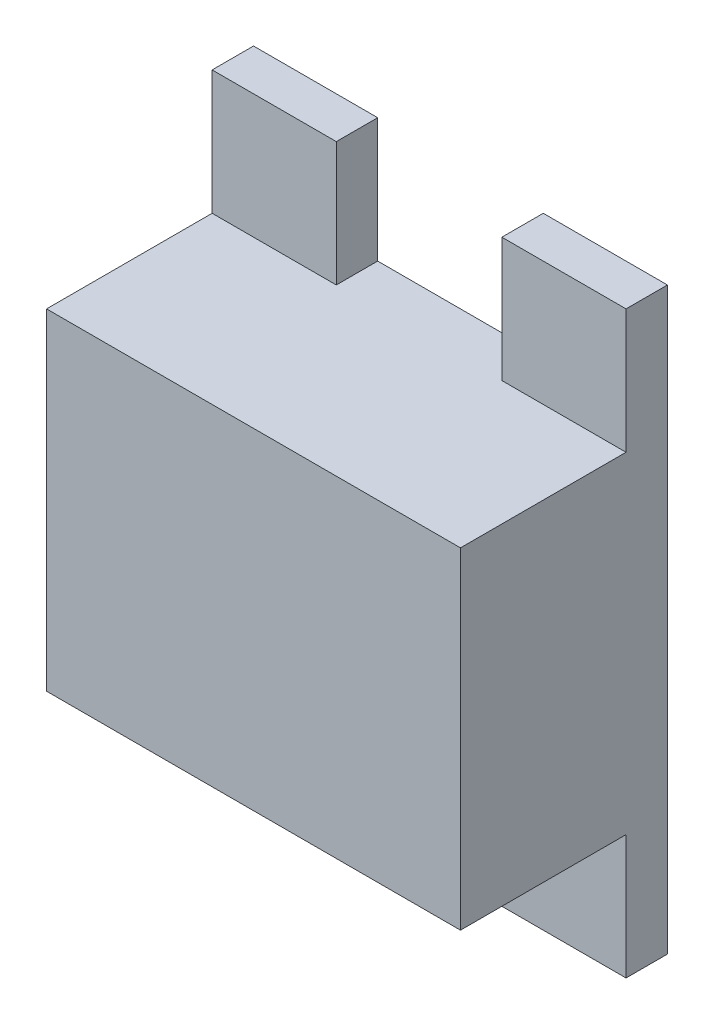
ISO-10303-21;
HEADER;
FILE_DESCRIPTION(('STEP AP214'),'2;1');
FILE_NAME('part.step','',(''),(''),'','','');
FILE_SCHEMA(('AUTOMOTIVE_DESIGN { 1 0 10303 214 1 1 1 1 }'));
ENDSEC;
DATA;
#1=APPLICATION_CONTEXT('core data for automotive mechanical design processes');
#2=APPLICATION_PROTOCOL_DEFINITION('international standard','automotive_design',2000,#1);
#3=PRODUCT_CONTEXT('',#1,'mechanical');
#4=PRODUCT('Part','Part','',(#3));
#5=PRODUCT_RELATED_PRODUCT_CATEGORY('part','',(#4));
#6=PRODUCT_DEFINITION_FORMATION('','',#4);
#7=PRODUCT_DEFINITION_CONTEXT('part definition',#1,'design');
#8=PRODUCT_DEFINITION('design','',#6,#7);
#9=PRODUCT_DEFINITION_SHAPE('','',#8);
#10=(LENGTH_UNIT() NAMED_UNIT(*) SI_UNIT(.MILLI.,.METRE.));
#11=(NAMED_UNIT(*) PLANE_ANGLE_UNIT() SI_UNIT($,.RADIAN.));
#12=(NAMED_UNIT(*) SI_UNIT($,.STERADIAN.) SOLID_ANGLE_UNIT());
#13=UNCERTAINTY_MEASURE_WITH_UNIT(LENGTH_MEASURE(1.E-05),#10,'distance_accuracy_value','');
#14=(GEOMETRIC_REPRESENTATION_CONTEXT(3) GLOBAL_UNCERTAINTY_ASSIGNED_CONTEXT((#13)) GLOBAL_UNIT_ASSIGNED_CONTEXT((#10,
#11,#12)) REPRESENTATION_CONTEXT('',''));
#15=CARTESIAN_POINT('',(0.,0.,0.));
#16=DIRECTION('',(0.,0.,1.));
#17=DIRECTION('',(1.,0.,0.));
#18=AXIS2_PLACEMENT_3D('',#15,#16,#17);
#19=CARTESIAN_POINT('',(0.,0.4,0.186842105263));
#20=DIRECTION('',(-1.,0.,0.));
#21=DIRECTION('',(0.,0.,1.));
#22=AXIS2_PLACEMENT_3D('',#19,#20,#21);
#23=PLANE('',#22);
#24=DIRECTION('',(0.,0.,1.));
#25=VECTOR('',#24,1.);
#26=CARTESIAN_POINT('',(0.,0.,0.));
#27=LINE('',#26,#25);
#28=CARTESIAN_POINT('',(0.,0.,0.1));
#29=VERTEX_POINT('',#28);
#30=CARTESIAN_POINT('',(0.,0.,0.5));
#31=VERTEX_POINT('',#30);
#32=EDGE_CURVE('E259',#29,#31,#27,.T.);
#33=ORIENTED_EDGE('',*,*,#32,.T.);
#34=DIRECTION('',(0.,1.,0.));
#35=VECTOR('',#34,1.);
#36=CARTESIAN_POINT('',(0.,0.,0.5));
#37=LINE('',#36,#35);
#38=CARTESIAN_POINT('',(0.,0.8,0.5));
#39=VERTEX_POINT('',#38);
#40=EDGE_CURVE('E218',#31,#39,#37,.T.);
#41=ORIENTED_EDGE('',*,*,#40,.T.);
#42=DIRECTION('',(0.,0.,1.));
#43=VECTOR('',#42,1.);
#44=CARTESIAN_POINT('',(0.,0.8,0.));
#45=LINE('',#44,#43);
#46=CARTESIAN_POINT('',(0.,0.8,0.1));
#47=VERTEX_POINT('',#46);
#48=EDGE_CURVE('E210',#47,#39,#45,.T.);
#49=ORIENTED_EDGE('',*,*,#48,.F.);
#50=DIRECTION('',(0.,1.,0.));
#51=VECTOR('',#50,1.);
#52=CARTESIAN_POINT('',(0.,0.6,0.1));
#53=LINE('',#52,#51);
#54=CARTESIAN_POINT('',(0.,1.1,0.1));
#55=VERTEX_POINT('',#54);
#56=EDGE_CURVE('E273',#47,#55,#53,.T.);
#57=ORIENTED_EDGE('',*,*,#56,.T.);
#58=DIRECTION('',(0.,0.,1.));
#59=VECTOR('',#58,1.);
#60=CARTESIAN_POINT('',(0.,1.1,0.));
#61=LINE('',#60,#59);
#62=CARTESIAN_POINT('',(0.,1.1,0.));
#63=VERTEX_POINT('',#62);
#64=EDGE_CURVE('E323',#63,#55,#61,.T.);
#65=ORIENTED_EDGE('',*,*,#64,.F.);
#66=DIRECTION('',(0.,1.,0.));
#67=VECTOR('',#66,1.);
#68=CARTESIAN_POINT('',(0.,-0.3,0.));
#69=LINE('',#68,#67);
#70=CARTESIAN_POINT('',(0.,-0.3,0.));
#71=VERTEX_POINT('',#70);
#72=EDGE_CURVE('E25',#71,#63,#69,.T.);
#73=ORIENTED_EDGE('',*,*,#72,.F.);
#74=DIRECTION('',(0.,0.,1.));
#75=VECTOR('',#74,1.);
#76=CARTESIAN_POINT('',(0.,-0.3,0.));
#77=LINE('',#76,#75);
#78=CARTESIAN_POINT('',(0.,-0.3,0.1));
#79=VERTEX_POINT('',#78);
#80=EDGE_CURVE('E335',#71,#79,#77,.T.);
#81=ORIENTED_EDGE('',*,*,#80,.T.);
#82=DIRECTION('',(0.,1.,0.));
#83=VECTOR('',#82,1.);
#84=CARTESIAN_POINT('',(0.,-0.3,0.1));
#85=LINE('',#84,#83);
#86=EDGE_CURVE('E238',#79,#29,#85,.T.);
#87=ORIENTED_EDGE('',*,*,#86,.T.);
#88=EDGE_LOOP('',(#33,#41,#49,#57,#65,#73,#81,#87));
#89=FACE_BOUND('',#88,.T.);
#90=ADVANCED_FACE('F17',(#89),#23,.T.);
#91=CARTESIAN_POINT('',(1.,0.4,0.186842105263));
#92=DIRECTION('',(1.,0.,0.));
#93=DIRECTION('',(0.,1.,0.));
#94=AXIS2_PLACEMENT_3D('',#91,#92,#93);
#95=PLANE('',#94);
#96=DIRECTION('',(0.,1.,0.));
#97=VECTOR('',#96,1.);
#98=CARTESIAN_POINT('',(1.,0.6,0.));
#99=LINE('',#98,#97);
#100=CARTESIAN_POINT('',(1.,-0.3,0.));
#101=VERTEX_POINT('',#100);
#102=CARTESIAN_POINT('',(1.,1.1,0.));
#103=VERTEX_POINT('',#102);
#104=EDGE_CURVE('E11',#101,#103,#99,.T.);
#105=ORIENTED_EDGE('',*,*,#104,.T.);
#106=DIRECTION('',(0.,0.,1.));
#107=VECTOR('',#106,1.);
#108=CARTESIAN_POINT('',(1.,1.1,0.));
#109=LINE('',#108,#107);
#110=CARTESIAN_POINT('',(1.,1.1,0.1));
#111=VERTEX_POINT('',#110);
#112=EDGE_CURVE('E222',#103,#111,#109,.T.);
#113=ORIENTED_EDGE('',*,*,#112,.T.);
#114=DIRECTION('',(0.,1.,0.));
#115=VECTOR('',#114,1.);
#116=CARTESIAN_POINT('',(1.,0.6,0.1));
#117=LINE('',#116,#115);
#118=CARTESIAN_POINT('',(1.,0.8,0.1));
#119=VERTEX_POINT('',#118);
#120=EDGE_CURVE('E178',#119,#111,#117,.T.);
#121=ORIENTED_EDGE('',*,*,#120,.F.);
#122=DIRECTION('',(0.,0.,1.));
#123=VECTOR('',#122,1.);
#124=CARTESIAN_POINT('',(1.,0.8,0.));
#125=LINE('',#124,#123);
#126=CARTESIAN_POINT('',(1.,0.8,0.5));
#127=VERTEX_POINT('',#126);
#128=EDGE_CURVE('E173',#119,#127,#125,.T.);
#129=ORIENTED_EDGE('',*,*,#128,.T.);
#130=DIRECTION('',(0.,1.,0.));
#131=VECTOR('',#130,1.);
#132=CARTESIAN_POINT('',(1.,0.,0.5));
#133=LINE('',#132,#131);
#134=CARTESIAN_POINT('',(1.,0.,0.5));
#135=VERTEX_POINT('',#134);
#136=EDGE_CURVE('E244',#135,#127,#133,.T.);
#137=ORIENTED_EDGE('',*,*,#136,.F.);
#138=DIRECTION('',(0.,0.,1.));
#139=VECTOR('',#138,1.);
#140=CARTESIAN_POINT('',(1.,0.,0.));
#141=LINE('',#140,#139);
#142=CARTESIAN_POINT('',(1.,0.,0.1));
#143=VERTEX_POINT('',#142);
#144=EDGE_CURVE('E258',#143,#135,#141,.T.);
#145=ORIENTED_EDGE('',*,*,#144,.F.);
#146=DIRECTION('',(0.,1.,0.));
#147=VECTOR('',#146,1.);
#148=CARTESIAN_POINT('',(1.,-0.3,0.1));
#149=LINE('',#148,#147);
#150=CARTESIAN_POINT('',(1.,-0.3,0.1));
#151=VERTEX_POINT('',#150);
#152=EDGE_CURVE('E307',#151,#143,#149,.T.);
#153=ORIENTED_EDGE('',*,*,#152,.F.);
#154=DIRECTION('',(0.,0.,1.));
#155=VECTOR('',#154,1.);
#156=CARTESIAN_POINT('',(1.,-0.3,0.));
#157=LINE('',#156,#155);
#158=EDGE_CURVE('E326',#101,#151,#157,.T.);
#159=ORIENTED_EDGE('',*,*,#158,.F.);
#160=EDGE_LOOP('',(#105,#113,#121,#129,#137,#145,#153,#159));
#161=FACE_BOUND('',#160,.T.);
#162=ADVANCED_FACE('F361',(#161),#95,.T.);
#163=CARTESIAN_POINT('',(0.5,0.4,0.));
#164=DIRECTION('',(0.,0.,-1.));
#165=DIRECTION('',(0.,-1.,0.));
#166=AXIS2_PLACEMENT_3D('',#163,#164,#165);
#167=PLANE('',#166);
#168=DIRECTION('',(1.,0.,0.));
#169=VECTOR('',#168,1.);
#170=CARTESIAN_POINT('',(0.7,-0.3,0.));
#171=LINE('',#170,#169);
#172=CARTESIAN_POINT('',(0.7,-0.3,0.));
#173=VERTEX_POINT('',#172);
#174=EDGE_CURVE('E328',#173,#101,#171,.T.);
#175=ORIENTED_EDGE('',*,*,#174,.F.);
#176=DIRECTION('',(0.,1.,0.));
#177=VECTOR('',#176,1.);
#178=CARTESIAN_POINT('',(0.7,-0.3,0.));
#179=LINE('',#178,#177);
#180=CARTESIAN_POINT('',(0.7,0.,0.));
#181=VERTEX_POINT('',#180);
#182=EDGE_CURVE('E293',#173,#181,#179,.T.);
#183=ORIENTED_EDGE('',*,*,#182,.T.);
#184=DIRECTION('',(1.,0.,0.));
#185=VECTOR('',#184,1.);
#186=CARTESIAN_POINT('',(0.,0.,0.));
#187=LINE('',#186,#185);
#188=CARTESIAN_POINT('',(0.3,0.,0.));
#189=VERTEX_POINT('',#188);
#190=EDGE_CURVE('E269',#189,#181,#187,.T.);
#191=ORIENTED_EDGE('',*,*,#190,.F.);
#192=DIRECTION('',(0.,1.,0.));
#193=VECTOR('',#192,1.);
#194=CARTESIAN_POINT('',(0.3,-0.3,0.));
#195=LINE('',#194,#193);
#196=CARTESIAN_POINT('',(0.3,-0.3,0.));
#197=VERTEX_POINT('',#196);
#198=EDGE_CURVE('E320',#197,#189,#195,.T.);
#199=ORIENTED_EDGE('',*,*,#198,.F.);
#200=DIRECTION('',(1.,0.,0.));
#201=VECTOR('',#200,1.);
#202=CARTESIAN_POINT('',(0.,-0.3,0.));
#203=LINE('',#202,#201);
#204=EDGE_CURVE('E333',#71,#197,#203,.T.);
#205=ORIENTED_EDGE('',*,*,#204,.F.);
#206=ORIENTED_EDGE('',*,*,#72,.T.);
#207=DIRECTION('',(1.,0.,0.));
#208=VECTOR('',#207,1.);
#209=CARTESIAN_POINT('',(0.,1.1,0.));
#210=LINE('',#209,#208);
#211=CARTESIAN_POINT('',(0.3,1.1,0.));
#212=VERTEX_POINT('',#211);
#213=EDGE_CURVE('E319',#63,#212,#210,.T.);
#214=ORIENTED_EDGE('',*,*,#213,.T.);
#215=DIRECTION('',(0.,1.,0.));
#216=VECTOR('',#215,1.);
#217=CARTESIAN_POINT('',(0.3,0.6,0.));
#218=LINE('',#217,#216);
#219=CARTESIAN_POINT('',(0.3,0.8,0.));
#220=VERTEX_POINT('',#219);
#221=EDGE_CURVE('E286',#220,#212,#218,.T.);
#222=ORIENTED_EDGE('',*,*,#221,.F.);
#223=DIRECTION('',(1.,0.,0.));
#224=VECTOR('',#223,1.);
#225=CARTESIAN_POINT('',(0.,0.8,0.));
#226=LINE('',#225,#224);
#227=CARTESIAN_POINT('',(0.7,0.8,0.));
#228=VERTEX_POINT('',#227);
#229=EDGE_CURVE('E223',#220,#228,#226,.T.);
#230=ORIENTED_EDGE('',*,*,#229,.T.);
#231=DIRECTION('',(0.,1.,0.));
#232=VECTOR('',#231,1.);
#233=CARTESIAN_POINT('',(0.7,0.6,0.));
#234=LINE('',#233,#232);
#235=CARTESIAN_POINT('',(0.7,1.1,0.));
#236=VERTEX_POINT('',#235);
#237=EDGE_CURVE('E186',#228,#236,#234,.T.);
#238=ORIENTED_EDGE('',*,*,#237,.T.);
#239=DIRECTION('',(1.,0.,0.));
#240=VECTOR('',#239,1.);
#241=CARTESIAN_POINT('',(0.7,1.1,0.));
#242=LINE('',#241,#240);
#243=EDGE_CURVE('E187',#236,#103,#242,.T.);
#244=ORIENTED_EDGE('',*,*,#243,.T.);
#245=ORIENTED_EDGE('',*,*,#104,.F.);
#246=EDGE_LOOP('',(#175,#183,#191,#199,#205,#206,#214,#222,#230,#238,#244,#245));
#247=FACE_BOUND('',#246,.T.);
#248=ADVANCED_FACE('F338',(#247),#167,.T.);
#249=CARTESIAN_POINT('',(0.,-0.3,0.));
#250=DIRECTION('',(0.,1.,0.));
#251=DIRECTION('',(1.,0.,0.));
#252=AXIS2_PLACEMENT_3D('',#249,#250,#251);
#253=PLANE('',#252);
#254=DIRECTION('',(0.,0.,1.));
#255=VECTOR('',#254,1.);
#256=CARTESIAN_POINT('',(0.3,-0.3,0.));
#257=LINE('',#256,#255);
#258=CARTESIAN_POINT('',(0.3,-0.3,0.1));
#259=VERTEX_POINT('',#258);
#260=EDGE_CURVE('E314',#197,#259,#257,.T.);
#261=ORIENTED_EDGE('',*,*,#260,.T.);
#262=DIRECTION('',(1.,0.,0.));
#263=VECTOR('',#262,1.);
#264=CARTESIAN_POINT('',(0.,-0.3,0.1));
#265=LINE('',#264,#263);
#266=EDGE_CURVE('E233',#79,#259,#265,.T.);
#267=ORIENTED_EDGE('',*,*,#266,.F.);
#268=ORIENTED_EDGE('',*,*,#80,.F.);
#269=ORIENTED_EDGE('',*,*,#204,.T.);
#270=EDGE_LOOP('',(#261,#267,#268,#269));
#271=FACE_BOUND('',#270,.T.);
#272=ADVANCED_FACE('F393',(#271),#253,.F.);
#273=CARTESIAN_POINT('',(0.7,-0.3,0.));
#274=DIRECTION('',(0.,1.,0.));
#275=DIRECTION('',(1.,0.,0.));
#276=AXIS2_PLACEMENT_3D('',#273,#274,#275);
#277=PLANE('',#276);
#278=ORIENTED_EDGE('',*,*,#158,.T.);
#279=DIRECTION('',(1.,0.,0.));
#280=VECTOR('',#279,1.);
#281=CARTESIAN_POINT('',(0.7,-0.3,0.1));
#282=LINE('',#281,#280);
#283=CARTESIAN_POINT('',(0.7,-0.3,0.1));
#284=VERTEX_POINT('',#283);
#285=EDGE_CURVE('E303',#284,#151,#282,.T.);
#286=ORIENTED_EDGE('',*,*,#285,.F.);
#287=DIRECTION('',(0.,0.,1.));
#288=VECTOR('',#287,1.);
#289=CARTESIAN_POINT('',(0.7,-0.3,0.));
#290=LINE('',#289,#288);
#291=EDGE_CURVE('E296',#173,#284,#290,.T.);
#292=ORIENTED_EDGE('',*,*,#291,.F.);
#293=ORIENTED_EDGE('',*,*,#174,.T.);
#294=EDGE_LOOP('',(#278,#286,#292,#293));
#295=FACE_BOUND('',#294,.T.);
#296=ADVANCED_FACE('F400',(#295),#277,.F.);
#297=CARTESIAN_POINT('',(0.,1.1,0.));
#298=DIRECTION('',(0.,1.,0.));
#299=DIRECTION('',(1.,0.,0.));
#300=AXIS2_PLACEMENT_3D('',#297,#298,#299);
#301=PLANE('',#300);
#302=ORIENTED_EDGE('',*,*,#213,.F.);
#303=ORIENTED_EDGE('',*,*,#64,.T.);
#304=DIRECTION('',(1.,0.,0.));
#305=VECTOR('',#304,1.);
#306=CARTESIAN_POINT('',(0.,1.1,0.1));
#307=LINE('',#306,#305);
#308=CARTESIAN_POINT('',(0.3,1.1,0.1));
#309=VERTEX_POINT('',#308);
#310=EDGE_CURVE('E282',#55,#309,#307,.T.);
#311=ORIENTED_EDGE('',*,*,#310,.T.);
#312=DIRECTION('',(0.,0.,1.));
#313=VECTOR('',#312,1.);
#314=CARTESIAN_POINT('',(0.3,1.1,0.));
#315=LINE('',#314,#313);
#316=EDGE_CURVE('E289',#212,#309,#315,.T.);
#317=ORIENTED_EDGE('',*,*,#316,.F.);
#318=EDGE_LOOP('',(#302,#303,#311,#317));
#319=FACE_BOUND('',#318,.T.);
#320=ADVANCED_FACE('F346',(#319),#301,.T.);
#321=CARTESIAN_POINT('',(0.3,-0.3,0.));
#322=DIRECTION('',(1.,0.,0.));
#323=DIRECTION('',(0.,1.,0.));
#324=AXIS2_PLACEMENT_3D('',#321,#322,#323);
#325=PLANE('',#324);
#326=DIRECTION('',(0.,1.,0.));
#327=VECTOR('',#326,1.);
#328=CARTESIAN_POINT('',(0.3,-0.3,0.1));
#329=LINE('',#328,#327);
#330=CARTESIAN_POINT('',(0.3,0.,0.1));
#331=VERTEX_POINT('',#330);
#332=EDGE_CURVE('E236',#259,#331,#329,.T.);
#333=ORIENTED_EDGE('',*,*,#332,.F.);
#334=ORIENTED_EDGE('',*,*,#260,.F.);
#335=ORIENTED_EDGE('',*,*,#198,.T.);
#336=DIRECTION('',(0.,0.,-1.));
#337=VECTOR('',#336,1.);
#338=CARTESIAN_POINT('',(0.3,0.,0.));
#339=LINE('',#338,#337);
#340=EDGE_CURVE('E266',#331,#189,#339,.T.);
#341=ORIENTED_EDGE('',*,*,#340,.F.);
#342=EDGE_LOOP('',(#333,#334,#335,#341));
#343=FACE_BOUND('',#342,.T.);
#344=ADVANCED_FACE('F404',(#343),#325,.T.);
#345=CARTESIAN_POINT('',(0.,-0.3,0.1));
#346=DIRECTION('',(0.,0.,1.));
#347=DIRECTION('',(1.,0.,0.));
#348=AXIS2_PLACEMENT_3D('',#345,#346,#347);
#349=PLANE('',#348);
#350=ORIENTED_EDGE('',*,*,#86,.F.);
#351=ORIENTED_EDGE('',*,*,#266,.T.);
#352=ORIENTED_EDGE('',*,*,#332,.T.);
#353=DIRECTION('',(1.,0.,0.));
#354=VECTOR('',#353,1.);
#355=CARTESIAN_POINT('',(0.,0.,0.1));
#356=LINE('',#355,#354);
#357=EDGE_CURVE('E265',#29,#331,#356,.T.);
#358=ORIENTED_EDGE('',*,*,#357,.F.);
#359=EDGE_LOOP('',(#350,#351,#352,#358));
#360=FACE_BOUND('',#359,.T.);
#361=ADVANCED_FACE('F405',(#360),#349,.T.);
#362=CARTESIAN_POINT('',(0.7,-0.3,0.1));
#363=DIRECTION('',(0.,0.,1.));
#364=DIRECTION('',(1.,0.,0.));
#365=AXIS2_PLACEMENT_3D('',#362,#363,#364);
#366=PLANE('',#365);
#367=DIRECTION('',(0.,1.,0.));
#368=VECTOR('',#367,1.);
#369=CARTESIAN_POINT('',(0.7,-0.3,0.1));
#370=LINE('',#369,#368);
#371=CARTESIAN_POINT('',(0.7,0.,0.1));
#372=VERTEX_POINT('',#371);
#373=EDGE_CURVE('E299',#284,#372,#370,.T.);
#374=ORIENTED_EDGE('',*,*,#373,.F.);
#375=ORIENTED_EDGE('',*,*,#285,.T.);
#376=ORIENTED_EDGE('',*,*,#152,.T.);
#377=DIRECTION('',(1.,0.,0.));
#378=VECTOR('',#377,1.);
#379=CARTESIAN_POINT('',(0.35,0.,0.1));
#380=LINE('',#379,#378);
#381=EDGE_CURVE('E252',#372,#143,#380,.T.);
#382=ORIENTED_EDGE('',*,*,#381,.F.);
#383=EDGE_LOOP('',(#374,#375,#376,#382));
#384=FACE_BOUND('',#383,.T.);
#385=ADVANCED_FACE('F402',(#384),#366,.T.);
#386=CARTESIAN_POINT('',(0.7,-0.3,0.));
#387=DIRECTION('',(1.,0.,0.));
#388=DIRECTION('',(0.,1.,0.));
#389=AXIS2_PLACEMENT_3D('',#386,#387,#388);
#390=PLANE('',#389);
#391=DIRECTION('',(0.,0.,-1.));
#392=VECTOR('',#391,1.);
#393=CARTESIAN_POINT('',(0.7,0.,0.));
#394=LINE('',#393,#392);
#395=EDGE_CURVE('E248',#372,#181,#394,.T.);
#396=ORIENTED_EDGE('',*,*,#395,.T.);
#397=ORIENTED_EDGE('',*,*,#182,.F.);
#398=ORIENTED_EDGE('',*,*,#291,.T.);
#399=ORIENTED_EDGE('',*,*,#373,.T.);
#400=EDGE_LOOP('',(#396,#397,#398,#399));
#401=FACE_BOUND('',#400,.T.);
#402=ADVANCED_FACE('F408',(#401),#390,.F.);
#403=CARTESIAN_POINT('',(0.3,0.6,0.));
#404=DIRECTION('',(1.,0.,0.));
#405=DIRECTION('',(0.,1.,0.));
#406=AXIS2_PLACEMENT_3D('',#403,#404,#405);
#407=PLANE('',#406);
#408=DIRECTION('',(0.,0.,-1.));
#409=VECTOR('',#408,1.);
#410=CARTESIAN_POINT('',(0.3,0.8,0.));
#411=LINE('',#410,#409);
#412=CARTESIAN_POINT('',(0.3,0.8,0.1));
#413=VERTEX_POINT('',#412);
#414=EDGE_CURVE('E211',#413,#220,#411,.T.);
#415=ORIENTED_EDGE('',*,*,#414,.T.);
#416=ORIENTED_EDGE('',*,*,#221,.T.);
#417=ORIENTED_EDGE('',*,*,#316,.T.);
#418=DIRECTION('',(0.,1.,0.));
#419=VECTOR('',#418,1.);
#420=CARTESIAN_POINT('',(0.3,0.6,0.1));
#421=LINE('',#420,#419);
#422=EDGE_CURVE('E279',#413,#309,#421,.T.);
#423=ORIENTED_EDGE('',*,*,#422,.F.);
#424=EDGE_LOOP('',(#415,#416,#417,#423));
#425=FACE_BOUND('',#424,.T.);
#426=ADVANCED_FACE('F347',(#425),#407,.T.);
#427=CARTESIAN_POINT('',(0.,0.6,0.1));
#428=DIRECTION('',(0.,0.,1.));
#429=DIRECTION('',(1.,0.,0.));
#430=AXIS2_PLACEMENT_3D('',#427,#428,#429);
#431=PLANE('',#430);
#432=ORIENTED_EDGE('',*,*,#56,.F.);
#433=DIRECTION('',(1.,0.,0.));
#434=VECTOR('',#433,1.);
#435=CARTESIAN_POINT('',(0.,0.8,0.1));
#436=LINE('',#435,#434);
#437=EDGE_CURVE('E208',#47,#413,#436,.T.);
#438=ORIENTED_EDGE('',*,*,#437,.T.);
#439=ORIENTED_EDGE('',*,*,#422,.T.);
#440=ORIENTED_EDGE('',*,*,#310,.F.);
#441=EDGE_LOOP('',(#432,#438,#439,#440));
#442=FACE_BOUND('',#441,.T.);
#443=ADVANCED_FACE('F352',(#442),#431,.T.);
#444=CARTESIAN_POINT('',(0.,0.,0.));
#445=DIRECTION('',(0.,1.,0.));
#446=DIRECTION('',(1.,0.,0.));
#447=AXIS2_PLACEMENT_3D('',#444,#445,#446);
#448=PLANE('',#447);
#449=ORIENTED_EDGE('',*,*,#395,.F.);
#450=ORIENTED_EDGE('',*,*,#381,.T.);
#451=ORIENTED_EDGE('',*,*,#144,.T.);
#452=DIRECTION('',(1.,0.,0.));
#453=VECTOR('',#452,1.);
#454=CARTESIAN_POINT('',(0.,0.,0.5));
#455=LINE('',#454,#453);
#456=EDGE_CURVE('E241',#31,#135,#455,.T.);
#457=ORIENTED_EDGE('',*,*,#456,.F.);
#458=ORIENTED_EDGE('',*,*,#32,.F.);
#459=ORIENTED_EDGE('',*,*,#357,.T.);
#460=ORIENTED_EDGE('',*,*,#340,.T.);
#461=ORIENTED_EDGE('',*,*,#190,.T.);
#462=EDGE_LOOP('',(#449,#450,#451,#457,#458,#459,#460,#461));
#463=FACE_BOUND('',#462,.T.);
#464=ADVANCED_FACE('F416',(#463),#448,.F.);
#465=CARTESIAN_POINT('',(0.,0.,0.5));
#466=DIRECTION('',(0.,0.,1.));
#467=DIRECTION('',(1.,0.,0.));
#468=AXIS2_PLACEMENT_3D('',#465,#466,#467);
#469=PLANE('',#468);
#470=ORIENTED_EDGE('',*,*,#40,.F.);
#471=ORIENTED_EDGE('',*,*,#456,.T.);
#472=ORIENTED_EDGE('',*,*,#136,.T.);
#473=DIRECTION('',(1.,0.,0.));
#474=VECTOR('',#473,1.);
#475=CARTESIAN_POINT('',(0.,0.8,0.5));
#476=LINE('',#475,#474);
#477=EDGE_CURVE('E202',#39,#127,#476,.T.);
#478=ORIENTED_EDGE('',*,*,#477,.F.);
#479=EDGE_LOOP('',(#470,#471,#472,#478));
#480=FACE_BOUND('',#479,.T.);
#481=ADVANCED_FACE('F357',(#480),#469,.T.);
#482=CARTESIAN_POINT('',(0.7,0.6,0.1));
#483=DIRECTION('',(0.,0.,1.));
#484=DIRECTION('',(1.,0.,0.));
#485=AXIS2_PLACEMENT_3D('',#482,#483,#484);
#486=PLANE('',#485);
#487=DIRECTION('',(0.,1.,0.));
#488=VECTOR('',#487,1.);
#489=CARTESIAN_POINT('',(0.7,0.6,0.1));
#490=LINE('',#489,#488);
#491=CARTESIAN_POINT('',(0.7,0.8,0.1));
#492=VERTEX_POINT('',#491);
#493=CARTESIAN_POINT('',(0.7,1.1,0.1));
#494=VERTEX_POINT('',#493);
#495=EDGE_CURVE('E182',#492,#494,#490,.T.);
#496=ORIENTED_EDGE('',*,*,#495,.F.);
#497=DIRECTION('',(1.,0.,0.));
#498=VECTOR('',#497,1.);
#499=CARTESIAN_POINT('',(0.35,0.8,0.1));
#500=LINE('',#499,#498);
#501=EDGE_CURVE('E167',#492,#119,#500,.T.);
#502=ORIENTED_EDGE('',*,*,#501,.T.);
#503=ORIENTED_EDGE('',*,*,#120,.T.);
#504=DIRECTION('',(1.,0.,0.));
#505=VECTOR('',#504,1.);
#506=CARTESIAN_POINT('',(0.7,1.1,0.1));
#507=LINE('',#506,#505);
#508=EDGE_CURVE('E195',#494,#111,#507,.T.);
#509=ORIENTED_EDGE('',*,*,#508,.F.);
#510=EDGE_LOOP('',(#496,#502,#503,#509));
#511=FACE_BOUND('',#510,.T.);
#512=ADVANCED_FACE('F189',(#511),#486,.T.);
#513=CARTESIAN_POINT('',(0.,0.8,0.));
#514=DIRECTION('',(0.,1.,0.));
#515=DIRECTION('',(1.,0.,0.));
#516=AXIS2_PLACEMENT_3D('',#513,#514,#515);
#517=PLANE('',#516);
#518=ORIENTED_EDGE('',*,*,#229,.F.);
#519=ORIENTED_EDGE('',*,*,#414,.F.);
#520=ORIENTED_EDGE('',*,*,#437,.F.);
#521=ORIENTED_EDGE('',*,*,#48,.T.);
#522=ORIENTED_EDGE('',*,*,#477,.T.);
#523=ORIENTED_EDGE('',*,*,#128,.F.);
#524=ORIENTED_EDGE('',*,*,#501,.F.);
#525=DIRECTION('',(0.,0.,-1.));
#526=VECTOR('',#525,1.);
#527=CARTESIAN_POINT('',(0.7,0.8,0.));
#528=LINE('',#527,#526);
#529=EDGE_CURVE('E168',#492,#228,#528,.T.);
#530=ORIENTED_EDGE('',*,*,#529,.T.);
#531=EDGE_LOOP('',(#518,#519,#520,#521,#522,#523,#524,#530));
#532=FACE_BOUND('',#531,.T.);
#533=ADVANCED_FACE('F166',(#532),#517,.T.);
#534=CARTESIAN_POINT('',(0.7,1.1,0.));
#535=DIRECTION('',(0.,1.,0.));
#536=DIRECTION('',(1.,0.,0.));
#537=AXIS2_PLACEMENT_3D('',#534,#535,#536);
#538=PLANE('',#537);
#539=ORIENTED_EDGE('',*,*,#243,.F.);
#540=DIRECTION('',(0.,0.,1.));
#541=VECTOR('',#540,1.);
#542=CARTESIAN_POINT('',(0.7,1.1,0.));
#543=LINE('',#542,#541);
#544=EDGE_CURVE('E194',#236,#494,#543,.T.);
#545=ORIENTED_EDGE('',*,*,#544,.T.);
#546=ORIENTED_EDGE('',*,*,#508,.T.);
#547=ORIENTED_EDGE('',*,*,#112,.F.);
#548=EDGE_LOOP('',(#539,#545,#546,#547));
#549=FACE_BOUND('',#548,.T.);
#550=ADVANCED_FACE('F370',(#549),#538,.T.);
#551=CARTESIAN_POINT('',(0.7,0.6,0.));
#552=DIRECTION('',(1.,0.,0.));
#553=DIRECTION('',(0.,1.,0.));
#554=AXIS2_PLACEMENT_3D('',#551,#552,#553);
#555=PLANE('',#554);
#556=ORIENTED_EDGE('',*,*,#495,.T.);
#557=ORIENTED_EDGE('',*,*,#544,.F.);
#558=ORIENTED_EDGE('',*,*,#237,.F.);
#559=ORIENTED_EDGE('',*,*,#529,.F.);
#560=EDGE_LOOP('',(#556,#557,#558,#559));
#561=FACE_BOUND('',#560,.T.);
#562=ADVANCED_FACE('F181',(#561),#555,.F.);
#563=CLOSED_SHELL('',(#90,#162,#248,#272,#296,#320,#344,#361,#385,#402,#426,#443,#464,#481,#512,
#533,#550,#562));
#564=MANIFOLD_SOLID_BREP('B1',#563);
#565=ADVANCED_BREP_SHAPE_REPRESENTATION('',(#18,#564),#14);
#566=SHAPE_DEFINITION_REPRESENTATION(#9,#565);
ENDSEC;
END-ISO-10303-21;
